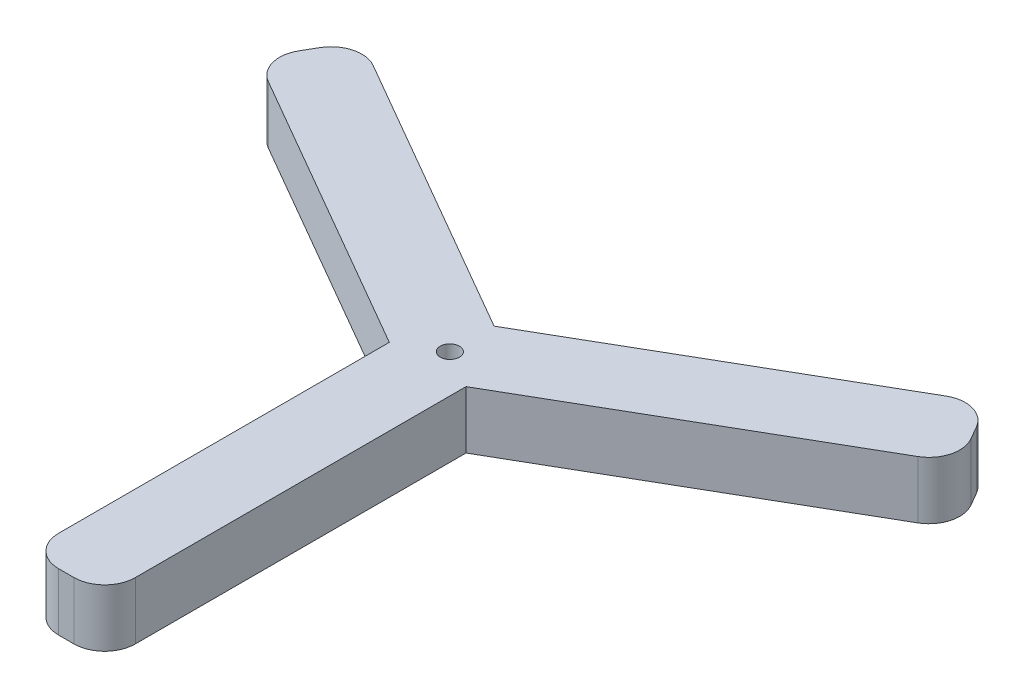
ISO-10303-21;
HEADER;
FILE_DESCRIPTION(('STEP AP214'),'2;1');
FILE_NAME('part.step','',(''),(''),'','','');
FILE_SCHEMA(('AUTOMOTIVE_DESIGN { 1 0 10303 214 1 1 1 1 }'));
ENDSEC;
DATA;
#1=APPLICATION_CONTEXT('core data for automotive mechanical design processes');
#2=APPLICATION_PROTOCOL_DEFINITION('international standard','automotive_design',2000,#1);
#3=PRODUCT_CONTEXT('',#1,'mechanical');
#4=PRODUCT('Part','Part','',(#3));
#5=PRODUCT_RELATED_PRODUCT_CATEGORY('part','',(#4));
#6=PRODUCT_DEFINITION_FORMATION('','',#4);
#7=PRODUCT_DEFINITION_CONTEXT('part definition',#1,'design');
#8=PRODUCT_DEFINITION('design','',#6,#7);
#9=PRODUCT_DEFINITION_SHAPE('','',#8);
#10=(LENGTH_UNIT() NAMED_UNIT(*) SI_UNIT(.MILLI.,.METRE.));
#11=(NAMED_UNIT(*) PLANE_ANGLE_UNIT() SI_UNIT($,.RADIAN.));
#12=(NAMED_UNIT(*) SI_UNIT($,.STERADIAN.) SOLID_ANGLE_UNIT());
#13=UNCERTAINTY_MEASURE_WITH_UNIT(LENGTH_MEASURE(1.E-05),#10,'distance_accuracy_value','');
#14=(GEOMETRIC_REPRESENTATION_CONTEXT(3) GLOBAL_UNCERTAINTY_ASSIGNED_CONTEXT((#13)) GLOBAL_UNIT_ASSIGNED_CONTEXT((#10,
#11,#12)) REPRESENTATION_CONTEXT('',''));
#15=CARTESIAN_POINT('',(0.,0.,0.));
#16=DIRECTION('',(0.,0.,1.));
#17=DIRECTION('',(1.,0.,0.));
#18=AXIS2_PLACEMENT_3D('',#15,#16,#17);
#19=CARTESIAN_POINT('',(-2.5,15.,-4.33012701892229));
#20=DIRECTION('',(-0.499999999999992,0.,-0.866025403784443));
#21=DIRECTION('',(-0.866025403784443,0.,0.499999999999992));
#22=AXIS2_PLACEMENT_3D('',#19,#20,#21);
#23=PLANE('',#22);
#24=DIRECTION('',(0.866025403784443,0.,-0.499999999999992));
#25=VECTOR('',#24,1.);
#26=CARTESIAN_POINT('',(-2.5,0.,-4.33012701892229));
#27=LINE('',#26,#25);
#28=CARTESIAN_POINT('',(10.0000000000001,0.,-11.5470053837925));
#29=VERTEX_POINT('',#28);
#30=CARTESIAN_POINT('',(84.6743371481688,0.,-54.6602540378437));
#31=VERTEX_POINT('',#30);
#32=EDGE_CURVE('E156',#29,#31,#27,.T.);
#33=ORIENTED_EDGE('',*,*,#32,.F.);
#34=DIRECTION('',(0.,-1.,0.));
#35=VECTOR('',#34,1.);
#36=CARTESIAN_POINT('',(10.0000000000001,15.,-11.5470053837925));
#37=LINE('',#36,#35);
#38=CARTESIAN_POINT('',(10.0000000000001,15.,-11.5470053837925));
#39=VERTEX_POINT('',#38);
#40=EDGE_CURVE('E150',#39,#29,#37,.T.);
#41=ORIENTED_EDGE('',*,*,#40,.F.);
#42=DIRECTION('',(0.866025403784443,0.,-0.499999999999992));
#43=VECTOR('',#42,1.);
#44=CARTESIAN_POINT('',(-2.5,15.,-4.33012701892229));
#45=LINE('',#44,#43);
#46=CARTESIAN_POINT('',(84.6743371481688,15.,-54.6602540378437));
#47=VERTEX_POINT('',#46);
#48=EDGE_CURVE('E153',#39,#47,#45,.T.);
#49=ORIENTED_EDGE('',*,*,#48,.T.);
#50=DIRECTION('',(0.,-1.,0.));
#51=VECTOR('',#50,1.);
#52=CARTESIAN_POINT('',(84.6743371481688,15.,-54.6602540378437));
#53=LINE('',#52,#51);
#54=EDGE_CURVE('E203',#47,#31,#53,.T.);
#55=ORIENTED_EDGE('',*,*,#54,.T.);
#56=EDGE_LOOP('',(#33,#41,#49,#55));
#57=FACE_BOUND('',#56,.T.);
#58=ADVANCED_FACE('F39',(#57),#23,.T.);
#59=CARTESIAN_POINT('',(7.50000000000008,15.,-12.9903810567666));
#60=DIRECTION('',(-0.500000000000004,0.,0.866025403784436));
#61=DIRECTION('',(0.866025403784436,0.,0.500000000000004));
#62=AXIS2_PLACEMENT_3D('',#59,#60,#61);
#63=PLANE('',#62);
#64=DIRECTION('',(-0.866025403784436,0.,-0.500000000000004));
#65=VECTOR('',#64,1.);
#66=CARTESIAN_POINT('',(7.50000000000008,0.,-12.9903810567666));
#67=LINE('',#66,#65);
#68=CARTESIAN_POINT('',(-64.6743371481681,0.,-54.6602540378447));
#69=VERTEX_POINT('',#68);
#70=EDGE_CURVE('E205',#29,#69,#67,.T.);
#71=ORIENTED_EDGE('',*,*,#70,.T.);
#72=DIRECTION('',(0.,-1.,0.));
#73=VECTOR('',#72,1.);
#74=CARTESIAN_POINT('',(-64.6743371481681,15.,-54.6602540378447));
#75=LINE('',#74,#73);
#76=CARTESIAN_POINT('',(-64.6743371481681,15.,-54.6602540378447));
#77=VERTEX_POINT('',#76);
#78=EDGE_CURVE('E160',#77,#69,#75,.T.);
#79=ORIENTED_EDGE('',*,*,#78,.F.);
#80=DIRECTION('',(-0.866025403784436,0.,-0.500000000000004));
#81=VECTOR('',#80,1.);
#82=CARTESIAN_POINT('',(7.50000000000008,15.,-12.9903810567666));
#83=LINE('',#82,#81);
#84=EDGE_CURVE('E163',#39,#77,#83,.T.);
#85=ORIENTED_EDGE('',*,*,#84,.F.);
#86=ORIENTED_EDGE('',*,*,#40,.T.);
#87=EDGE_LOOP('',(#71,#79,#85,#86));
#88=FACE_BOUND('',#87,.T.);
#89=ADVANCED_FACE('F164',(#88),#63,.F.);
#90=CARTESIAN_POINT('',(-68.6743371481682,15.,-47.7320508075692));
#91=DIRECTION('',(0.,-1.,0.));
#92=DIRECTION('',(0.,0.,-1.));
#93=AXIS2_PLACEMENT_3D('',#90,#91,#92);
#94=CYLINDRICAL_SURFACE('',#93,7.99999999999999);
#95=CARTESIAN_POINT('',(-68.6743371481682,0.,-47.7320508075692));
#96=DIRECTION('',(0.,1.,0.));
#97=DIRECTION('',(0.,0.,1.));
#98=AXIS2_PLACEMENT_3D('',#95,#96,#97);
#99=CIRCLE('',#98,7.99999999999999);
#100=CARTESIAN_POINT('',(-75.6025403784437,0.,-51.7320508075692));
#101=VERTEX_POINT('',#100);
#102=EDGE_CURVE('E208',#69,#101,#99,.T.);
#103=ORIENTED_EDGE('',*,*,#102,.T.);
#104=DIRECTION('',(0.,-1.,0.));
#105=VECTOR('',#104,1.);
#106=CARTESIAN_POINT('',(-75.6025403784437,15.,-51.7320508075692));
#107=LINE('',#106,#105);
#108=CARTESIAN_POINT('',(-75.6025403784437,15.,-51.7320508075692));
#109=VERTEX_POINT('',#108);
#110=EDGE_CURVE('E250',#109,#101,#107,.T.);
#111=ORIENTED_EDGE('',*,*,#110,.F.);
#112=CARTESIAN_POINT('',(-68.6743371481682,15.,-47.7320508075692));
#113=DIRECTION('',(0.,1.,0.));
#114=DIRECTION('',(0.,0.,1.));
#115=AXIS2_PLACEMENT_3D('',#112,#113,#114);
#116=CIRCLE('',#115,7.99999999999999);
#117=EDGE_CURVE('E167',#77,#109,#116,.T.);
#118=ORIENTED_EDGE('',*,*,#117,.F.);
#119=ORIENTED_EDGE('',*,*,#78,.T.);
#120=EDGE_LOOP('',(#103,#111,#118,#119));
#121=FACE_BOUND('',#120,.T.);
#122=ADVANCED_FACE('F292',(#121),#94,.T.);
#123=CARTESIAN_POINT('',(-79.1025403784437,15.,-45.6698729810782));
#124=DIRECTION('',(0.866025403784436,0.,0.500000000000004));
#125=DIRECTION('',(0.500000000000004,0.,-0.866025403784436));
#126=AXIS2_PLACEMENT_3D('',#123,#124,#125);
#127=PLANE('',#126);
#128=DIRECTION('',(-0.500000000000004,0.,0.866025403784436));
#129=VECTOR('',#128,1.);
#130=CARTESIAN_POINT('',(-79.1025403784437,0.,-45.6698729810782));
#131=LINE('',#130,#129);
#132=CARTESIAN_POINT('',(-77.6025403784436,0.,-48.2679491924316));
#133=VERTEX_POINT('',#132);
#134=EDGE_CURVE('E210',#101,#133,#131,.T.);
#135=ORIENTED_EDGE('',*,*,#134,.T.);
#136=DIRECTION('',(0.,-1.,0.));
#137=VECTOR('',#136,1.);
#138=CARTESIAN_POINT('',(-77.6025403784436,15.,-48.2679491924316));
#139=LINE('',#138,#137);
#140=CARTESIAN_POINT('',(-77.6025403784436,15.,-48.2679491924316));
#141=VERTEX_POINT('',#140);
#142=EDGE_CURVE('E248',#141,#133,#139,.T.);
#143=ORIENTED_EDGE('',*,*,#142,.F.);
#144=DIRECTION('',(-0.500000000000004,0.,0.866025403784436));
#145=VECTOR('',#144,1.);
#146=CARTESIAN_POINT('',(-79.1025403784437,15.,-45.6698729810782));
#147=LINE('',#146,#145);
#148=EDGE_CURVE('E182',#109,#141,#147,.T.);
#149=ORIENTED_EDGE('',*,*,#148,.F.);
#150=ORIENTED_EDGE('',*,*,#110,.T.);
#151=EDGE_LOOP('',(#135,#143,#149,#150));
#152=FACE_BOUND('',#151,.T.);
#153=ADVANCED_FACE('F289',(#152),#127,.F.);
#154=CARTESIAN_POINT('',(-70.6743371481682,15.,-44.2679491924315));
#155=DIRECTION('',(0.,-1.,0.));
#156=DIRECTION('',(0.,0.,-1.));
#157=AXIS2_PLACEMENT_3D('',#154,#155,#156);
#158=CYLINDRICAL_SURFACE('',#157,8.);
#159=CARTESIAN_POINT('',(-70.6743371481682,0.,-44.2679491924315));
#160=DIRECTION('',(0.,1.,0.));
#161=DIRECTION('',(0.,0.,1.));
#162=AXIS2_PLACEMENT_3D('',#159,#160,#161);
#163=CIRCLE('',#162,8.);
#164=CARTESIAN_POINT('',(-74.6743371481682,0.,-37.339745962156));
#165=VERTEX_POINT('',#164);
#166=EDGE_CURVE('E213',#165,#133,#163,.F.);
#167=ORIENTED_EDGE('',*,*,#166,.F.);
#168=DIRECTION('',(0.,-1.,0.));
#169=VECTOR('',#168,1.);
#170=CARTESIAN_POINT('',(-74.6743371481682,15.,-37.339745962156));
#171=LINE('',#170,#169);
#172=CARTESIAN_POINT('',(-74.6743371481682,15.,-37.339745962156));
#173=VERTEX_POINT('',#172);
#174=EDGE_CURVE('E246',#173,#165,#171,.T.);
#175=ORIENTED_EDGE('',*,*,#174,.F.);
#176=CARTESIAN_POINT('',(-70.6743371481682,15.,-44.2679491924315));
#177=DIRECTION('',(0.,1.,0.));
#178=DIRECTION('',(0.,0.,1.));
#179=AXIS2_PLACEMENT_3D('',#176,#177,#178);
#180=CIRCLE('',#179,8.);
#181=EDGE_CURVE('E184',#173,#141,#180,.F.);
#182=ORIENTED_EDGE('',*,*,#181,.T.);
#183=ORIENTED_EDGE('',*,*,#142,.T.);
#184=EDGE_LOOP('',(#167,#175,#182,#183));
#185=FACE_BOUND('',#184,.T.);
#186=ADVANCED_FACE('F284',(#185),#158,.T.);
#187=CARTESIAN_POINT('',(-2.5,15.,4.33012701892215));
#188=DIRECTION('',(-0.500000000000004,0.,0.866025403784436));
#189=DIRECTION('',(0.866025403784436,0.,0.500000000000004));
#190=AXIS2_PLACEMENT_3D('',#187,#188,#189);
#191=PLANE('',#190);
#192=DIRECTION('',(-0.866025403784436,0.,-0.500000000000004));
#193=VECTOR('',#192,1.);
#194=CARTESIAN_POINT('',(-2.5,0.,4.33012701892215));
#195=LINE('',#194,#193);
#196=CARTESIAN_POINT('',(0.,0.,5.77350269189623));
#197=VERTEX_POINT('',#196);
#198=EDGE_CURVE('E216',#197,#165,#195,.T.);
#199=ORIENTED_EDGE('',*,*,#198,.F.);
#200=DIRECTION('',(0.,-1.,0.));
#201=VECTOR('',#200,1.);
#202=CARTESIAN_POINT('',(0.,15.,5.77350269189623));
#203=LINE('',#202,#201);
#204=CARTESIAN_POINT('',(0.,15.,5.77350269189623));
#205=VERTEX_POINT('',#204);
#206=EDGE_CURVE('E244',#205,#197,#203,.T.);
#207=ORIENTED_EDGE('',*,*,#206,.F.);
#208=DIRECTION('',(-0.866025403784436,0.,-0.500000000000004));
#209=VECTOR('',#208,1.);
#210=CARTESIAN_POINT('',(-2.5,15.,4.33012701892215));
#211=LINE('',#210,#209);
#212=EDGE_CURVE('E187',#205,#173,#211,.T.);
#213=ORIENTED_EDGE('',*,*,#212,.T.);
#214=ORIENTED_EDGE('',*,*,#174,.T.);
#215=EDGE_LOOP('',(#199,#207,#213,#214));
#216=FACE_BOUND('',#215,.T.);
#217=ADVANCED_FACE('F279',(#216),#191,.T.);
#218=CARTESIAN_POINT('',(0.,15.,0.));
#219=DIRECTION('',(1.,0.,0.));
#220=DIRECTION('',(0.,0.,-1.));
#221=AXIS2_PLACEMENT_3D('',#218,#219,#220);
#222=PLANE('',#221);
#223=DIRECTION('',(0.,0.,1.));
#224=VECTOR('',#223,1.);
#225=CARTESIAN_POINT('',(0.,0.,0.));
#226=LINE('',#225,#224);
#227=CARTESIAN_POINT('',(0.,0.,92.));
#228=VERTEX_POINT('',#227);
#229=EDGE_CURVE('E219',#197,#228,#226,.T.);
#230=ORIENTED_EDGE('',*,*,#229,.T.);
#231=DIRECTION('',(0.,-1.,0.));
#232=VECTOR('',#231,1.);
#233=CARTESIAN_POINT('',(0.,15.,92.));
#234=LINE('',#233,#232);
#235=CARTESIAN_POINT('',(0.,15.,92.));
#236=VERTEX_POINT('',#235);
#237=EDGE_CURVE('E62',#228,#236,#234,.F.);
#238=ORIENTED_EDGE('',*,*,#237,.T.);
#239=DIRECTION('',(0.,0.,1.));
#240=VECTOR('',#239,1.);
#241=CARTESIAN_POINT('',(0.,15.,0.));
#242=LINE('',#241,#240);
#243=EDGE_CURVE('E190',#205,#236,#242,.T.);
#244=ORIENTED_EDGE('',*,*,#243,.F.);
#245=ORIENTED_EDGE('',*,*,#206,.T.);
#246=EDGE_LOOP('',(#230,#238,#244,#245));
#247=FACE_BOUND('',#246,.T.);
#248=ADVANCED_FACE('F277',(#247),#222,.F.);
#249=CARTESIAN_POINT('',(0.,15.,100.));
#250=DIRECTION('',(0.,0.,-1.));
#251=DIRECTION('',(-1.,0.,0.));
#252=AXIS2_PLACEMENT_3D('',#249,#250,#251);
#253=PLANE('',#252);
#254=DIRECTION('',(1.,0.,0.));
#255=VECTOR('',#254,1.);
#256=CARTESIAN_POINT('',(0.,15.,100.));
#257=LINE('',#256,#255);
#258=CARTESIAN_POINT('',(8.00000000000001,15.,100.));
#259=VERTEX_POINT('',#258);
#260=CARTESIAN_POINT('',(12.,15.,100.));
#261=VERTEX_POINT('',#260);
#262=EDGE_CURVE('E192',#259,#261,#257,.T.);
#263=ORIENTED_EDGE('',*,*,#262,.F.);
#264=DIRECTION('',(0.,-1.,0.));
#265=VECTOR('',#264,1.);
#266=CARTESIAN_POINT('',(8.00000000000001,15.,100.));
#267=LINE('',#266,#265);
#268=CARTESIAN_POINT('',(8.00000000000001,0.,100.));
#269=VERTEX_POINT('',#268);
#270=EDGE_CURVE('E255',#259,#269,#267,.T.);
#271=ORIENTED_EDGE('',*,*,#270,.T.);
#272=DIRECTION('',(1.,0.,0.));
#273=VECTOR('',#272,1.);
#274=CARTESIAN_POINT('',(0.,0.,100.));
#275=LINE('',#274,#273);
#276=CARTESIAN_POINT('',(12.,0.,100.));
#277=VERTEX_POINT('',#276);
#278=EDGE_CURVE('E221',#269,#277,#275,.T.);
#279=ORIENTED_EDGE('',*,*,#278,.T.);
#280=DIRECTION('',(0.,-1.,0.));
#281=VECTOR('',#280,1.);
#282=CARTESIAN_POINT('',(12.,15.,100.));
#283=LINE('',#282,#281);
#284=EDGE_CURVE('E159',#277,#261,#283,.F.);
#285=ORIENTED_EDGE('',*,*,#284,.T.);
#286=EDGE_LOOP('',(#263,#271,#279,#285));
#287=FACE_BOUND('',#286,.T.);
#288=ADVANCED_FACE('F269',(#287),#253,.F.);
#289=CARTESIAN_POINT('',(20.,15.,0.));
#290=DIRECTION('',(1.,0.,0.));
#291=DIRECTION('',(0.,0.,-1.));
#292=AXIS2_PLACEMENT_3D('',#289,#290,#291);
#293=PLANE('',#292);
#294=DIRECTION('',(0.,0.,1.));
#295=VECTOR('',#294,1.);
#296=CARTESIAN_POINT('',(20.,15.,0.));
#297=LINE('',#296,#295);
#298=CARTESIAN_POINT('',(20.,15.,5.77350269189632));
#299=VERTEX_POINT('',#298);
#300=CARTESIAN_POINT('',(20.,15.,92.));
#301=VERTEX_POINT('',#300);
#302=EDGE_CURVE('E194',#299,#301,#297,.T.);
#303=ORIENTED_EDGE('',*,*,#302,.T.);
#304=DIRECTION('',(0.,-1.,0.));
#305=VECTOR('',#304,1.);
#306=CARTESIAN_POINT('',(20.,0.,92.));
#307=LINE('',#306,#305);
#308=CARTESIAN_POINT('',(20.,0.,92.));
#309=VERTEX_POINT('',#308);
#310=EDGE_CURVE('E11',#301,#309,#307,.T.);
#311=ORIENTED_EDGE('',*,*,#310,.T.);
#312=DIRECTION('',(0.,0.,1.));
#313=VECTOR('',#312,1.);
#314=CARTESIAN_POINT('',(20.,0.,0.));
#315=LINE('',#314,#313);
#316=CARTESIAN_POINT('',(20.,0.,5.77350269189632));
#317=VERTEX_POINT('',#316);
#318=EDGE_CURVE('E224',#317,#309,#315,.T.);
#319=ORIENTED_EDGE('',*,*,#318,.F.);
#320=DIRECTION('',(0.,-1.,0.));
#321=VECTOR('',#320,1.);
#322=CARTESIAN_POINT('',(20.,15.,5.77350269189632));
#323=LINE('',#322,#321);
#324=EDGE_CURVE('E242',#299,#317,#323,.T.);
#325=ORIENTED_EDGE('',*,*,#324,.F.);
#326=EDGE_LOOP('',(#303,#311,#319,#325));
#327=FACE_BOUND('',#326,.T.);
#328=ADVANCED_FACE('F313',(#327),#293,.T.);
#329=CARTESIAN_POINT('',(7.49999999999984,15.,12.9903810567666));
#330=DIRECTION('',(-0.499999999999992,0.,-0.866025403784443));
#331=DIRECTION('',(-0.866025403784443,0.,0.499999999999992));
#332=AXIS2_PLACEMENT_3D('',#329,#330,#331);
#333=PLANE('',#332);
#334=DIRECTION('',(0.866025403784443,0.,-0.499999999999992));
#335=VECTOR('',#334,1.);
#336=CARTESIAN_POINT('',(7.49999999999984,0.,12.9903810567666));
#337=LINE('',#336,#335);
#338=CARTESIAN_POINT('',(94.6743371481687,0.,-37.3397459621548));
#339=VERTEX_POINT('',#338);
#340=EDGE_CURVE('E227',#317,#339,#337,.T.);
#341=ORIENTED_EDGE('',*,*,#340,.T.);
#342=DIRECTION('',(0.,-1.,0.));
#343=VECTOR('',#342,1.);
#344=CARTESIAN_POINT('',(94.6743371481687,15.,-37.3397459621548));
#345=LINE('',#344,#343);
#346=CARTESIAN_POINT('',(94.6743371481687,15.,-37.3397459621548));
#347=VERTEX_POINT('',#346);
#348=EDGE_CURVE('E239',#347,#339,#345,.T.);
#349=ORIENTED_EDGE('',*,*,#348,.F.);
#350=DIRECTION('',(0.866025403784443,0.,-0.499999999999992));
#351=VECTOR('',#350,1.);
#352=CARTESIAN_POINT('',(7.49999999999984,15.,12.9903810567666));
#353=LINE('',#352,#351);
#354=EDGE_CURVE('E196',#299,#347,#353,.T.);
#355=ORIENTED_EDGE('',*,*,#354,.F.);
#356=ORIENTED_EDGE('',*,*,#324,.T.);
#357=EDGE_LOOP('',(#341,#349,#355,#356));
#358=FACE_BOUND('',#357,.T.);
#359=ADVANCED_FACE('F311',(#358),#333,.F.);
#360=CARTESIAN_POINT('',(90.6743371481688,15.,-44.2679491924304));
#361=DIRECTION('',(0.,-1.,0.));
#362=DIRECTION('',(0.,0.,-1.));
#363=AXIS2_PLACEMENT_3D('',#360,#361,#362);
#364=CYLINDRICAL_SURFACE('',#363,8.);
#365=CARTESIAN_POINT('',(90.6743371481688,0.,-44.2679491924304));
#366=DIRECTION('',(0.,1.,0.));
#367=DIRECTION('',(0.,0.,1.));
#368=AXIS2_PLACEMENT_3D('',#365,#366,#367);
#369=CIRCLE('',#368,8.);
#370=CARTESIAN_POINT('',(97.6025403784443,0.,-48.2679491924304));
#371=VERTEX_POINT('',#370);
#372=EDGE_CURVE('E229',#339,#371,#369,.T.);
#373=ORIENTED_EDGE('',*,*,#372,.T.);
#374=DIRECTION('',(0.,-1.,0.));
#375=VECTOR('',#374,1.);
#376=CARTESIAN_POINT('',(97.6025403784443,15.,-48.2679491924304));
#377=LINE('',#376,#375);
#378=CARTESIAN_POINT('',(97.6025403784443,15.,-48.2679491924304));
#379=VERTEX_POINT('',#378);
#380=EDGE_CURVE('E236',#379,#371,#377,.T.);
#381=ORIENTED_EDGE('',*,*,#380,.F.);
#382=CARTESIAN_POINT('',(90.6743371481688,15.,-44.2679491924304));
#383=DIRECTION('',(0.,1.,0.));
#384=DIRECTION('',(0.,0.,1.));
#385=AXIS2_PLACEMENT_3D('',#382,#383,#384);
#386=CIRCLE('',#385,8.);
#387=EDGE_CURVE('E198',#347,#379,#386,.T.);
#388=ORIENTED_EDGE('',*,*,#387,.F.);
#389=ORIENTED_EDGE('',*,*,#348,.T.);
#390=EDGE_LOOP('',(#373,#381,#388,#389));
#391=FACE_BOUND('',#390,.T.);
#392=ADVANCED_FACE('F306',(#391),#364,.T.);
#393=CARTESIAN_POINT('',(94.1025403784443,15.,-54.3301270189215));
#394=DIRECTION('',(-0.866025403784442,0.,0.499999999999993));
#395=DIRECTION('',(0.499999999999993,0.,0.866025403784442));
#396=AXIS2_PLACEMENT_3D('',#393,#394,#395);
#397=PLANE('',#396);
#398=DIRECTION('',(-0.499999999999994,0.,-0.866025403784443));
#399=VECTOR('',#398,1.);
#400=CARTESIAN_POINT('',(94.1025403784443,0.,-54.3301270189215));
#401=LINE('',#400,#399);
#402=CARTESIAN_POINT('',(95.6025403784444,0.,-51.7320508075681));
#403=VERTEX_POINT('',#402);
#404=EDGE_CURVE('E175',#371,#403,#401,.T.);
#405=ORIENTED_EDGE('',*,*,#404,.T.);
#406=DIRECTION('',(0.,-1.,0.));
#407=VECTOR('',#406,1.);
#408=CARTESIAN_POINT('',(95.6025403784444,15.,-51.7320508075681));
#409=LINE('',#408,#407);
#410=CARTESIAN_POINT('',(95.6025403784444,15.,-51.7320508075681));
#411=VERTEX_POINT('',#410);
#412=EDGE_CURVE('E234',#411,#403,#409,.T.);
#413=ORIENTED_EDGE('',*,*,#412,.F.);
#414=DIRECTION('',(-0.499999999999994,0.,-0.866025403784443));
#415=VECTOR('',#414,1.);
#416=CARTESIAN_POINT('',(94.1025403784443,15.,-54.3301270189215));
#417=LINE('',#416,#415);
#418=EDGE_CURVE('E200',#379,#411,#417,.T.);
#419=ORIENTED_EDGE('',*,*,#418,.F.);
#420=ORIENTED_EDGE('',*,*,#380,.T.);
#421=EDGE_LOOP('',(#405,#413,#419,#420));
#422=FACE_BOUND('',#421,.T.);
#423=ADVANCED_FACE('F300',(#422),#397,.F.);
#424=CARTESIAN_POINT('',(88.6743371481688,15.,-47.7320508075682));
#425=DIRECTION('',(0.,-1.,0.));
#426=DIRECTION('',(0.,0.,-1.));
#427=AXIS2_PLACEMENT_3D('',#424,#425,#426);
#428=CYLINDRICAL_SURFACE('',#427,8.);
#429=CARTESIAN_POINT('',(88.6743371481688,0.,-47.7320508075682));
#430=DIRECTION('',(0.,1.,0.));
#431=DIRECTION('',(0.,0.,1.));
#432=AXIS2_PLACEMENT_3D('',#429,#430,#431);
#433=CIRCLE('',#432,8.);
#434=EDGE_CURVE('E172',#31,#403,#433,.F.);
#435=ORIENTED_EDGE('',*,*,#434,.F.);
#436=ORIENTED_EDGE('',*,*,#54,.F.);
#437=CARTESIAN_POINT('',(88.6743371481688,15.,-47.7320508075682));
#438=DIRECTION('',(0.,1.,0.));
#439=DIRECTION('',(0.,0.,1.));
#440=AXIS2_PLACEMENT_3D('',#437,#438,#439);
#441=CIRCLE('',#440,8.);
#442=EDGE_CURVE('E171',#47,#411,#441,.F.);
#443=ORIENTED_EDGE('',*,*,#442,.T.);
#444=ORIENTED_EDGE('',*,*,#412,.T.);
#445=EDGE_LOOP('',(#435,#436,#443,#444));
#446=FACE_BOUND('',#445,.T.);
#447=ADVANCED_FACE('F296',(#446),#428,.T.);
#448=CARTESIAN_POINT('',(0.,15.,0.));
#449=DIRECTION('',(0.,1.,0.));
#450=DIRECTION('',(0.,0.,1.));
#451=AXIS2_PLACEMENT_3D('',#448,#449,#450);
#452=PLANE('',#451);
#453=CARTESIAN_POINT('',(10.0000000000001,15.,0.));
#454=DIRECTION('',(0.,1.,0.));
#455=DIRECTION('',(0.,0.,1.));
#456=AXIS2_PLACEMENT_3D('',#453,#454,#455);
#457=CIRCLE('',#456,2.5);
#458=CARTESIAN_POINT('',(10.0000000000001,15.,2.5));
#459=VERTEX_POINT('',#458);
#460=EDGE_CURVE('E178',#459,#459,#457,.T.);
#461=ORIENTED_EDGE('',*,*,#460,.F.);
#462=EDGE_LOOP('',(#461));
#463=FACE_BOUND('',#462,.T.);
#464=ORIENTED_EDGE('',*,*,#243,.T.);
#465=CARTESIAN_POINT('',(8.00000000000001,15.,92.));
#466=DIRECTION('',(0.,1.,0.));
#467=DIRECTION('',(0.,0.,1.));
#468=AXIS2_PLACEMENT_3D('',#465,#466,#467);
#469=CIRCLE('',#468,8.);
#470=EDGE_CURVE('E47',#236,#259,#469,.T.);
#471=ORIENTED_EDGE('',*,*,#470,.T.);
#472=ORIENTED_EDGE('',*,*,#262,.T.);
#473=CARTESIAN_POINT('',(12.,15.,92.));
#474=DIRECTION('',(0.,1.,0.));
#475=DIRECTION('',(0.,0.,1.));
#476=AXIS2_PLACEMENT_3D('',#473,#474,#475);
#477=CIRCLE('',#476,8.);
#478=EDGE_CURVE('E54',#261,#301,#477,.T.);
#479=ORIENTED_EDGE('',*,*,#478,.T.);
#480=ORIENTED_EDGE('',*,*,#302,.F.);
#481=ORIENTED_EDGE('',*,*,#354,.T.);
#482=ORIENTED_EDGE('',*,*,#387,.T.);
#483=ORIENTED_EDGE('',*,*,#418,.T.);
#484=ORIENTED_EDGE('',*,*,#442,.F.);
#485=ORIENTED_EDGE('',*,*,#48,.F.);
#486=ORIENTED_EDGE('',*,*,#84,.T.);
#487=ORIENTED_EDGE('',*,*,#117,.T.);
#488=ORIENTED_EDGE('',*,*,#148,.T.);
#489=ORIENTED_EDGE('',*,*,#181,.F.);
#490=ORIENTED_EDGE('',*,*,#212,.F.);
#491=EDGE_LOOP('',(#464,#471,#472,#479,#480,#481,#482,#483,#484,#485,#486,#487,#488,#489,#490));
#492=FACE_BOUND('',#491,.T.);
#493=ADVANCED_FACE('F169',(#463,#492),#452,.T.);
#494=CARTESIAN_POINT('',(0.,0.,0.));
#495=DIRECTION('',(0.,1.,0.));
#496=DIRECTION('',(0.,0.,1.));
#497=AXIS2_PLACEMENT_3D('',#494,#495,#496);
#498=PLANE('',#497);
#499=CARTESIAN_POINT('',(10.0000000000001,0.,0.));
#500=DIRECTION('',(0.,1.,0.));
#501=DIRECTION('',(0.,0.,1.));
#502=AXIS2_PLACEMENT_3D('',#499,#500,#501);
#503=CIRCLE('',#502,2.5);
#504=CARTESIAN_POINT('',(10.0000000000001,0.,2.5));
#505=VERTEX_POINT('',#504);
#506=EDGE_CURVE('E206',#505,#505,#503,.T.);
#507=ORIENTED_EDGE('',*,*,#506,.T.);
#508=EDGE_LOOP('',(#507));
#509=FACE_BOUND('',#508,.T.);
#510=ORIENTED_EDGE('',*,*,#278,.F.);
#511=CARTESIAN_POINT('',(8.00000000000001,0.,92.));
#512=DIRECTION('',(0.,1.,0.));
#513=DIRECTION('',(0.,0.,1.));
#514=AXIS2_PLACEMENT_3D('',#511,#512,#513);
#515=CIRCLE('',#514,8.);
#516=EDGE_CURVE('E260',#269,#228,#515,.F.);
#517=ORIENTED_EDGE('',*,*,#516,.T.);
#518=ORIENTED_EDGE('',*,*,#229,.F.);
#519=ORIENTED_EDGE('',*,*,#198,.T.);
#520=ORIENTED_EDGE('',*,*,#166,.T.);
#521=ORIENTED_EDGE('',*,*,#134,.F.);
#522=ORIENTED_EDGE('',*,*,#102,.F.);
#523=ORIENTED_EDGE('',*,*,#70,.F.);
#524=ORIENTED_EDGE('',*,*,#32,.T.);
#525=ORIENTED_EDGE('',*,*,#434,.T.);
#526=ORIENTED_EDGE('',*,*,#404,.F.);
#527=ORIENTED_EDGE('',*,*,#372,.F.);
#528=ORIENTED_EDGE('',*,*,#340,.F.);
#529=ORIENTED_EDGE('',*,*,#318,.T.);
#530=CARTESIAN_POINT('',(12.,0.,92.));
#531=DIRECTION('',(0.,1.,0.));
#532=DIRECTION('',(0.,0.,1.));
#533=AXIS2_PLACEMENT_3D('',#530,#531,#532);
#534=CIRCLE('',#533,8.);
#535=EDGE_CURVE('E258',#309,#277,#534,.F.);
#536=ORIENTED_EDGE('',*,*,#535,.T.);
#537=EDGE_LOOP('',(#510,#517,#518,#519,#520,#521,#522,#523,#524,#525,#526,#527,#528,#529,#536));
#538=FACE_BOUND('',#537,.T.);
#539=ADVANCED_FACE('F275',(#509,#538),#498,.F.);
#540=CARTESIAN_POINT('',(8.00000000000001,15.,92.));
#541=DIRECTION('',(0.,-1.,0.));
#542=DIRECTION('',(0.,0.,-1.));
#543=AXIS2_PLACEMENT_3D('',#540,#541,#542);
#544=CYLINDRICAL_SURFACE('',#543,8.);
#545=ORIENTED_EDGE('',*,*,#470,.F.);
#546=ORIENTED_EDGE('',*,*,#237,.F.);
#547=ORIENTED_EDGE('',*,*,#516,.F.);
#548=ORIENTED_EDGE('',*,*,#270,.F.);
#549=EDGE_LOOP('',(#545,#546,#547,#548));
#550=FACE_BOUND('',#549,.T.);
#551=ADVANCED_FACE('F272',(#550),#544,.T.);
#552=CARTESIAN_POINT('',(12.,15.,92.));
#553=DIRECTION('',(0.,1.,0.));
#554=DIRECTION('',(0.,0.,1.));
#555=AXIS2_PLACEMENT_3D('',#552,#553,#554);
#556=CYLINDRICAL_SURFACE('',#555,8.);
#557=ORIENTED_EDGE('',*,*,#478,.F.);
#558=ORIENTED_EDGE('',*,*,#284,.F.);
#559=ORIENTED_EDGE('',*,*,#535,.F.);
#560=ORIENTED_EDGE('',*,*,#310,.F.);
#561=EDGE_LOOP('',(#557,#558,#559,#560));
#562=FACE_BOUND('',#561,.T.);
#563=ADVANCED_FACE('F41',(#562),#556,.T.);
#564=CARTESIAN_POINT('',(10.0000000000001,0.,0.));
#565=DIRECTION('',(0.,1.,0.));
#566=DIRECTION('',(0.,0.,1.));
#567=AXIS2_PLACEMENT_3D('',#564,#565,#566);
#568=CYLINDRICAL_SURFACE('',#567,2.5);
#569=ORIENTED_EDGE('',*,*,#506,.F.);
#570=EDGE_LOOP('',(#569));
#571=FACE_BOUND('',#570,.T.);
#572=ORIENTED_EDGE('',*,*,#460,.T.);
#573=EDGE_LOOP('',(#572));
#574=FACE_BOUND('',#573,.T.);
#575=ADVANCED_FACE('F317',(#571,#574),#568,.F.);
#576=CLOSED_SHELL('',(#58,#89,#122,#153,#186,#217,#248,#288,#328,#359,#392,#423,#447,#493,#539,
#551,#563,#575));
#577=MANIFOLD_SOLID_BREP('B2',#576);
#578=ADVANCED_BREP_SHAPE_REPRESENTATION('',(#18,#577),#14);
#579=SHAPE_DEFINITION_REPRESENTATION(#9,#578);
ENDSEC;
END-ISO-10303-21;
